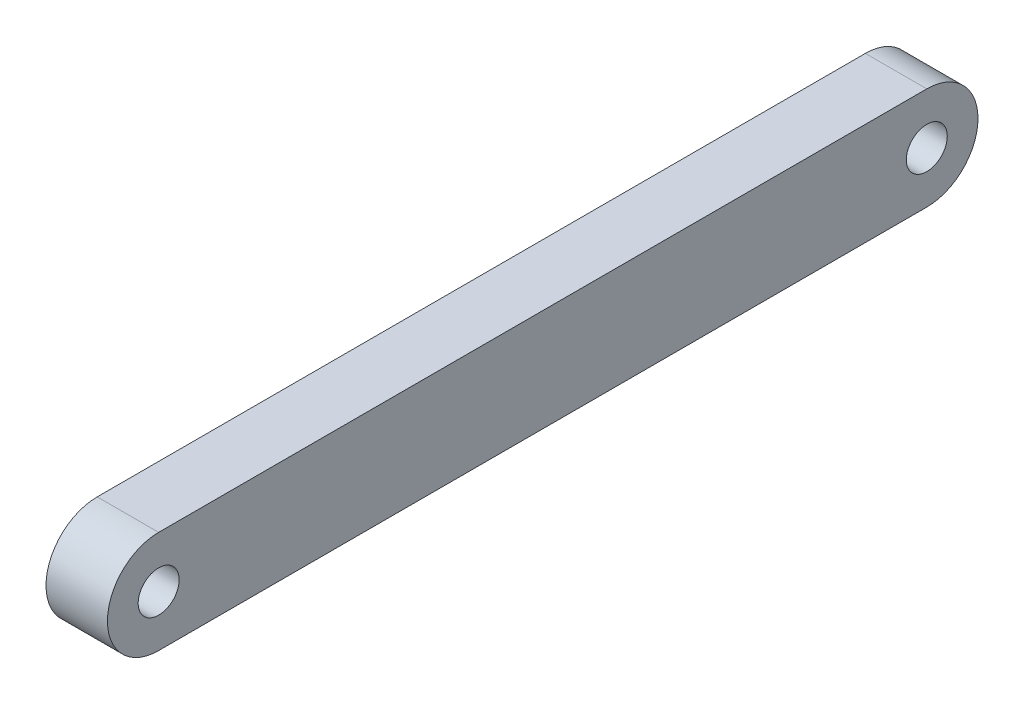
ISO-10303-21;
HEADER;
FILE_DESCRIPTION(('STEP AP214'),'2;1');
FILE_NAME('part.step','',(''),(''),'','','');
FILE_SCHEMA(('AUTOMOTIVE_DESIGN { 1 0 10303 214 1 1 1 1 }'));
ENDSEC;
DATA;
#1=APPLICATION_CONTEXT('core data for automotive mechanical design processes');
#2=APPLICATION_PROTOCOL_DEFINITION('international standard','automotive_design',2000,#1);
#3=PRODUCT_CONTEXT('',#1,'mechanical');
#4=PRODUCT('Part','Part','',(#3));
#5=PRODUCT_RELATED_PRODUCT_CATEGORY('part','',(#4));
#6=PRODUCT_DEFINITION_FORMATION('','',#4);
#7=PRODUCT_DEFINITION_CONTEXT('part definition',#1,'design');
#8=PRODUCT_DEFINITION('design','',#6,#7);
#9=PRODUCT_DEFINITION_SHAPE('','',#8);
#10=(LENGTH_UNIT() NAMED_UNIT(*) SI_UNIT(.MILLI.,.METRE.));
#11=(NAMED_UNIT(*) PLANE_ANGLE_UNIT() SI_UNIT($,.RADIAN.));
#12=(NAMED_UNIT(*) SI_UNIT($,.STERADIAN.) SOLID_ANGLE_UNIT());
#13=UNCERTAINTY_MEASURE_WITH_UNIT(LENGTH_MEASURE(1.E-05),#10,'distance_accuracy_value','');
#14=(GEOMETRIC_REPRESENTATION_CONTEXT(3) GLOBAL_UNCERTAINTY_ASSIGNED_CONTEXT((#13)) GLOBAL_UNIT_ASSIGNED_CONTEXT((#10,
#11,#12)) REPRESENTATION_CONTEXT('',''));
#15=CARTESIAN_POINT('',(0.,0.,0.));
#16=DIRECTION('',(0.,0.,1.));
#17=DIRECTION('',(1.,0.,0.));
#18=AXIS2_PLACEMENT_3D('',#15,#16,#17);
#19=CARTESIAN_POINT('',(6.,0.,0.));
#20=DIRECTION('',(-1.,0.,0.));
#21=DIRECTION('',(0.,0.,1.));
#22=AXIS2_PLACEMENT_3D('',#19,#20,#21);
#23=CYLINDRICAL_SURFACE('',#22,5.);
#24=CARTESIAN_POINT('',(0.,0.,0.));
#25=DIRECTION('',(1.,0.,0.));
#26=DIRECTION('',(0.,0.,-1.));
#27=AXIS2_PLACEMENT_3D('',#24,#25,#26);
#28=CIRCLE('',#27,5.);
#29=CARTESIAN_POINT('',(0.,5.,0.));
#30=VERTEX_POINT('',#29);
#31=CARTESIAN_POINT('',(0.,-5.,0.));
#32=VERTEX_POINT('',#31);
#33=EDGE_CURVE('E113',#30,#32,#28,.T.);
#34=ORIENTED_EDGE('',*,*,#33,.T.);
#35=DIRECTION('',(-1.,0.,0.));
#36=VECTOR('',#35,1.);
#37=CARTESIAN_POINT('',(6.,-5.,0.));
#38=LINE('',#37,#36);
#39=CARTESIAN_POINT('',(6.,-5.,0.));
#40=VERTEX_POINT('',#39);
#41=EDGE_CURVE('E11',#40,#32,#38,.T.);
#42=ORIENTED_EDGE('',*,*,#41,.F.);
#43=CARTESIAN_POINT('',(6.,0.,0.));
#44=DIRECTION('',(1.,0.,0.));
#45=DIRECTION('',(0.,0.,-1.));
#46=AXIS2_PLACEMENT_3D('',#43,#44,#45);
#47=CIRCLE('',#46,5.);
#48=CARTESIAN_POINT('',(6.,5.,0.));
#49=VERTEX_POINT('',#48);
#50=EDGE_CURVE('E97',#49,#40,#47,.T.);
#51=ORIENTED_EDGE('',*,*,#50,.F.);
#52=DIRECTION('',(-1.,0.,0.));
#53=VECTOR('',#52,1.);
#54=CARTESIAN_POINT('',(6.,5.,0.));
#55=LINE('',#54,#53);
#56=EDGE_CURVE('E109',#49,#30,#55,.T.);
#57=ORIENTED_EDGE('',*,*,#56,.T.);
#58=EDGE_LOOP('',(#34,#42,#51,#57));
#59=FACE_BOUND('',#58,.T.);
#60=ADVANCED_FACE('F45',(#59),#23,.T.);
#61=CARTESIAN_POINT('',(6.,-5.,0.));
#62=DIRECTION('',(0.,1.,0.));
#63=DIRECTION('',(0.,0.,1.));
#64=AXIS2_PLACEMENT_3D('',#61,#62,#63);
#65=PLANE('',#64);
#66=DIRECTION('',(0.,0.,-1.));
#67=VECTOR('',#66,1.);
#68=CARTESIAN_POINT('',(0.,-5.,0.));
#69=LINE('',#68,#67);
#70=CARTESIAN_POINT('',(0.,-5.,-75.));
#71=VERTEX_POINT('',#70);
#72=EDGE_CURVE('E102',#32,#71,#69,.T.);
#73=ORIENTED_EDGE('',*,*,#72,.T.);
#74=DIRECTION('',(-1.,0.,0.));
#75=VECTOR('',#74,1.);
#76=CARTESIAN_POINT('',(6.,-5.,-75.));
#77=LINE('',#76,#75);
#78=CARTESIAN_POINT('',(6.,-5.,-75.));
#79=VERTEX_POINT('',#78);
#80=EDGE_CURVE('E54',#79,#71,#77,.T.);
#81=ORIENTED_EDGE('',*,*,#80,.F.);
#82=DIRECTION('',(0.,0.,-1.));
#83=VECTOR('',#82,1.);
#84=CARTESIAN_POINT('',(6.,-5.,0.));
#85=LINE('',#84,#83);
#86=EDGE_CURVE('E92',#40,#79,#85,.T.);
#87=ORIENTED_EDGE('',*,*,#86,.F.);
#88=ORIENTED_EDGE('',*,*,#41,.T.);
#89=EDGE_LOOP('',(#73,#81,#87,#88));
#90=FACE_BOUND('',#89,.T.);
#91=ADVANCED_FACE('F101',(#90),#65,.F.);
#92=CARTESIAN_POINT('',(6.,0.,-75.));
#93=DIRECTION('',(-1.,0.,0.));
#94=DIRECTION('',(0.,0.,1.));
#95=AXIS2_PLACEMENT_3D('',#92,#93,#94);
#96=CYLINDRICAL_SURFACE('',#95,5.);
#97=CARTESIAN_POINT('',(0.,0.,-75.));
#98=DIRECTION('',(1.,0.,0.));
#99=DIRECTION('',(0.,0.,-1.));
#100=AXIS2_PLACEMENT_3D('',#97,#98,#99);
#101=CIRCLE('',#100,5.);
#102=CARTESIAN_POINT('',(0.,5.,-75.));
#103=VERTEX_POINT('',#102);
#104=EDGE_CURVE('E79',#71,#103,#101,.T.);
#105=ORIENTED_EDGE('',*,*,#104,.T.);
#106=DIRECTION('',(-1.,0.,0.));
#107=VECTOR('',#106,1.);
#108=CARTESIAN_POINT('',(6.,5.,-75.));
#109=LINE('',#108,#107);
#110=CARTESIAN_POINT('',(6.,5.,-75.));
#111=VERTEX_POINT('',#110);
#112=EDGE_CURVE('E104',#111,#103,#109,.T.);
#113=ORIENTED_EDGE('',*,*,#112,.F.);
#114=CARTESIAN_POINT('',(6.,0.,-75.));
#115=DIRECTION('',(1.,0.,0.));
#116=DIRECTION('',(0.,0.,-1.));
#117=AXIS2_PLACEMENT_3D('',#114,#115,#116);
#118=CIRCLE('',#117,5.);
#119=EDGE_CURVE('E95',#79,#111,#118,.T.);
#120=ORIENTED_EDGE('',*,*,#119,.F.);
#121=ORIENTED_EDGE('',*,*,#80,.T.);
#122=EDGE_LOOP('',(#105,#113,#120,#121));
#123=FACE_BOUND('',#122,.T.);
#124=ADVANCED_FACE('F105',(#123),#96,.T.);
#125=CARTESIAN_POINT('',(6.,5.,0.));
#126=DIRECTION('',(0.,-1.,0.));
#127=DIRECTION('',(0.,0.,-1.));
#128=AXIS2_PLACEMENT_3D('',#125,#126,#127);
#129=PLANE('',#128);
#130=DIRECTION('',(0.,0.,1.));
#131=VECTOR('',#130,1.);
#132=CARTESIAN_POINT('',(0.,5.,0.));
#133=LINE('',#132,#131);
#134=EDGE_CURVE('E85',#103,#30,#133,.T.);
#135=ORIENTED_EDGE('',*,*,#134,.T.);
#136=ORIENTED_EDGE('',*,*,#56,.F.);
#137=DIRECTION('',(0.,0.,1.));
#138=VECTOR('',#137,1.);
#139=CARTESIAN_POINT('',(6.,5.,0.));
#140=LINE('',#139,#138);
#141=EDGE_CURVE('E62',#111,#49,#140,.T.);
#142=ORIENTED_EDGE('',*,*,#141,.F.);
#143=ORIENTED_EDGE('',*,*,#112,.T.);
#144=EDGE_LOOP('',(#135,#136,#142,#143));
#145=FACE_BOUND('',#144,.T.);
#146=ADVANCED_FACE('F127',(#145),#129,.F.);
#147=CARTESIAN_POINT('',(6.,0.,0.));
#148=DIRECTION('',(1.,0.,0.));
#149=DIRECTION('',(0.,0.,-1.));
#150=AXIS2_PLACEMENT_3D('',#147,#148,#149);
#151=PLANE('',#150);
#152=CARTESIAN_POINT('',(6.,0.,-75.));
#153=DIRECTION('',(1.,0.,0.));
#154=DIRECTION('',(0.,0.,-1.));
#155=AXIS2_PLACEMENT_3D('',#152,#153,#154);
#156=CIRCLE('',#155,2.);
#157=CARTESIAN_POINT('',(6.,0.,-77.));
#158=VERTEX_POINT('',#157);
#159=EDGE_CURVE('E142',#158,#158,#156,.T.);
#160=ORIENTED_EDGE('',*,*,#159,.F.);
#161=EDGE_LOOP('',(#160));
#162=FACE_BOUND('',#161,.T.);
#163=CARTESIAN_POINT('',(6.,0.,0.));
#164=DIRECTION('',(1.,0.,0.));
#165=DIRECTION('',(0.,0.,-1.));
#166=AXIS2_PLACEMENT_3D('',#163,#164,#165);
#167=CIRCLE('',#166,2.);
#168=CARTESIAN_POINT('',(6.,0.,-2.));
#169=VERTEX_POINT('',#168);
#170=EDGE_CURVE('E138',#169,#169,#167,.T.);
#171=ORIENTED_EDGE('',*,*,#170,.F.);
#172=EDGE_LOOP('',(#171));
#173=FACE_BOUND('',#172,.T.);
#174=ORIENTED_EDGE('',*,*,#50,.T.);
#175=ORIENTED_EDGE('',*,*,#86,.T.);
#176=ORIENTED_EDGE('',*,*,#119,.T.);
#177=ORIENTED_EDGE('',*,*,#141,.T.);
#178=EDGE_LOOP('',(#174,#175,#176,#177));
#179=FACE_BOUND('',#178,.T.);
#180=ADVANCED_FACE('F93',(#162,#173,#179),#151,.T.);
#181=CARTESIAN_POINT('',(0.,0.,0.));
#182=DIRECTION('',(1.,0.,0.));
#183=DIRECTION('',(0.,0.,-1.));
#184=AXIS2_PLACEMENT_3D('',#181,#182,#183);
#185=PLANE('',#184);
#186=CARTESIAN_POINT('',(0.,0.,-75.));
#187=DIRECTION('',(1.,0.,0.));
#188=DIRECTION('',(0.,0.,-1.));
#189=AXIS2_PLACEMENT_3D('',#186,#187,#188);
#190=CIRCLE('',#189,2.);
#191=CARTESIAN_POINT('',(0.,0.,-77.));
#192=VERTEX_POINT('',#191);
#193=EDGE_CURVE('E117',#192,#192,#190,.T.);
#194=ORIENTED_EDGE('',*,*,#193,.T.);
#195=EDGE_LOOP('',(#194));
#196=FACE_BOUND('',#195,.T.);
#197=CARTESIAN_POINT('',(0.,0.,0.));
#198=DIRECTION('',(1.,0.,0.));
#199=DIRECTION('',(0.,0.,-1.));
#200=AXIS2_PLACEMENT_3D('',#197,#198,#199);
#201=CIRCLE('',#200,2.);
#202=CARTESIAN_POINT('',(0.,0.,-2.));
#203=VERTEX_POINT('',#202);
#204=EDGE_CURVE('E134',#203,#203,#201,.T.);
#205=ORIENTED_EDGE('',*,*,#204,.T.);
#206=EDGE_LOOP('',(#205));
#207=FACE_BOUND('',#206,.T.);
#208=ORIENTED_EDGE('',*,*,#33,.F.);
#209=ORIENTED_EDGE('',*,*,#134,.F.);
#210=ORIENTED_EDGE('',*,*,#104,.F.);
#211=ORIENTED_EDGE('',*,*,#72,.F.);
#212=EDGE_LOOP('',(#208,#209,#210,#211));
#213=FACE_BOUND('',#212,.T.);
#214=ADVANCED_FACE('F130',(#196,#207,#213),#185,.F.);
#215=CARTESIAN_POINT('',(0.,0.,0.));
#216=DIRECTION('',(1.,0.,0.));
#217=DIRECTION('',(0.,0.,-1.));
#218=AXIS2_PLACEMENT_3D('',#215,#216,#217);
#219=CYLINDRICAL_SURFACE('',#218,2.);
#220=ORIENTED_EDGE('',*,*,#204,.F.);
#221=EDGE_LOOP('',(#220));
#222=FACE_BOUND('',#221,.T.);
#223=ORIENTED_EDGE('',*,*,#170,.T.);
#224=EDGE_LOOP('',(#223));
#225=FACE_BOUND('',#224,.T.);
#226=ADVANCED_FACE('F155',(#222,#225),#219,.F.);
#227=CARTESIAN_POINT('',(0.,0.,-75.));
#228=DIRECTION('',(1.,0.,0.));
#229=DIRECTION('',(0.,0.,-1.));
#230=AXIS2_PLACEMENT_3D('',#227,#228,#229);
#231=CYLINDRICAL_SURFACE('',#230,2.);
#232=ORIENTED_EDGE('',*,*,#193,.F.);
#233=EDGE_LOOP('',(#232));
#234=FACE_BOUND('',#233,.T.);
#235=ORIENTED_EDGE('',*,*,#159,.T.);
#236=EDGE_LOOP('',(#235));
#237=FACE_BOUND('',#236,.T.);
#238=ADVANCED_FACE('F152',(#234,#237),#231,.F.);
#239=CLOSED_SHELL('',(#60,#91,#124,#146,#180,#214,#226,#238));
#240=MANIFOLD_SOLID_BREP('B2',#239);
#241=ADVANCED_BREP_SHAPE_REPRESENTATION('',(#18,#240),#14);
#242=SHAPE_DEFINITION_REPRESENTATION(#9,#241);
ENDSEC;
END-ISO-10303-21;
